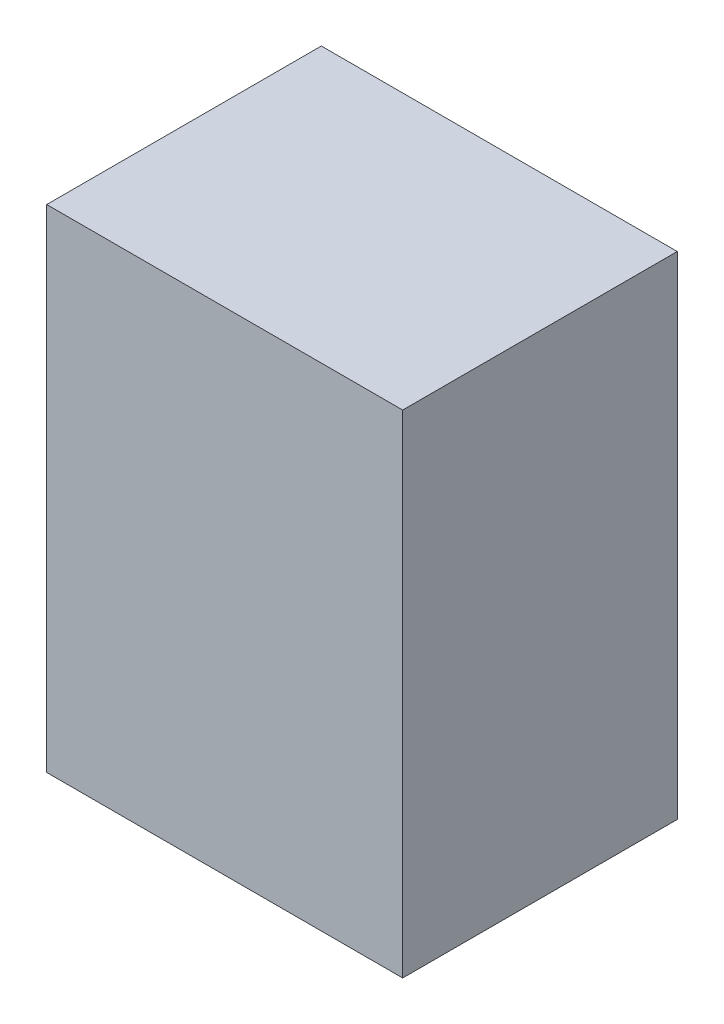
ISO-10303-21;
HEADER;
FILE_DESCRIPTION(('STEP AP214'),'2;1');
FILE_NAME('part.step','',(''),(''),'','','');
FILE_SCHEMA(('AUTOMOTIVE_DESIGN { 1 0 10303 214 1 1 1 1 }'));
ENDSEC;
DATA;
#1=APPLICATION_CONTEXT('core data for automotive mechanical design processes');
#2=APPLICATION_PROTOCOL_DEFINITION('international standard','automotive_design',2000,#1);
#3=PRODUCT_CONTEXT('',#1,'mechanical');
#4=PRODUCT('Part','Part','',(#3));
#5=PRODUCT_RELATED_PRODUCT_CATEGORY('part','',(#4));
#6=PRODUCT_DEFINITION_FORMATION('','',#4);
#7=PRODUCT_DEFINITION_CONTEXT('part definition',#1,'design');
#8=PRODUCT_DEFINITION('design','',#6,#7);
#9=PRODUCT_DEFINITION_SHAPE('','',#8);
#10=(LENGTH_UNIT() NAMED_UNIT(*) SI_UNIT(.MILLI.,.METRE.));
#11=(NAMED_UNIT(*) PLANE_ANGLE_UNIT() SI_UNIT($,.RADIAN.));
#12=(NAMED_UNIT(*) SI_UNIT($,.STERADIAN.) SOLID_ANGLE_UNIT());
#13=UNCERTAINTY_MEASURE_WITH_UNIT(LENGTH_MEASURE(1.E-05),#10,'distance_accuracy_value','');
#14=(GEOMETRIC_REPRESENTATION_CONTEXT(3) GLOBAL_UNCERTAINTY_ASSIGNED_CONTEXT((#13)) GLOBAL_UNIT_ASSIGNED_CONTEXT((#10,
#11,#12)) REPRESENTATION_CONTEXT('',''));
#15=CARTESIAN_POINT('',(0.,0.,0.));
#16=DIRECTION('',(0.,0.,1.));
#17=DIRECTION('',(1.,0.,0.));
#18=AXIS2_PLACEMENT_3D('',#15,#16,#17);
#19=CARTESIAN_POINT('',(58.335,188.09875,-45.));
#20=DIRECTION('',(-1.,0.,0.));
#21=DIRECTION('',(0.,0.,1.));
#22=AXIS2_PLACEMENT_3D('',#19,#20,#21);
#23=PLANE('',#22);
#24=DIRECTION('',(0.,0.,-1.));
#25=VECTOR('',#24,1.);
#26=CARTESIAN_POINT('',(58.335,26.87125,-45.));
#27=LINE('',#26,#25);
#28=CARTESIAN_POINT('',(58.335,26.87125,45.));
#29=VERTEX_POINT('',#28);
#30=CARTESIAN_POINT('',(58.335,26.87125,-45.));
#31=VERTEX_POINT('',#30);
#32=EDGE_CURVE('E108',#29,#31,#27,.T.);
#33=ORIENTED_EDGE('',*,*,#32,.T.);
#34=DIRECTION('',(0.,-1.,0.));
#35=VECTOR('',#34,1.);
#36=CARTESIAN_POINT('',(58.335,188.09875,-45.));
#37=LINE('',#36,#35);
#38=CARTESIAN_POINT('',(58.335,188.09875,-45.));
#39=VERTEX_POINT('',#38);
#40=EDGE_CURVE('E12',#39,#31,#37,.T.);
#41=ORIENTED_EDGE('',*,*,#40,.F.);
#42=DIRECTION('',(0.,0.,-1.));
#43=VECTOR('',#42,1.);
#44=CARTESIAN_POINT('',(58.335,188.09875,-45.));
#45=LINE('',#44,#43);
#46=CARTESIAN_POINT('',(58.335,188.09875,45.));
#47=VERTEX_POINT('',#46);
#48=EDGE_CURVE('E100',#47,#39,#45,.T.);
#49=ORIENTED_EDGE('',*,*,#48,.F.);
#50=DIRECTION('',(0.,-1.,0.));
#51=VECTOR('',#50,1.);
#52=CARTESIAN_POINT('',(58.335,188.09875,45.));
#53=LINE('',#52,#51);
#54=EDGE_CURVE('E104',#47,#29,#53,.T.);
#55=ORIENTED_EDGE('',*,*,#54,.T.);
#56=EDGE_LOOP('',(#33,#41,#49,#55));
#57=FACE_BOUND('',#56,.T.);
#58=ADVANCED_FACE('F46',(#57),#23,.F.);
#59=CARTESIAN_POINT('',(-58.335,188.09875,-45.));
#60=DIRECTION('',(0.,0.,1.));
#61=DIRECTION('',(1.,0.,0.));
#62=AXIS2_PLACEMENT_3D('',#59,#60,#61);
#63=PLANE('',#62);
#64=DIRECTION('',(-1.,0.,0.));
#65=VECTOR('',#64,1.);
#66=CARTESIAN_POINT('',(-58.335,26.87125,-45.));
#67=LINE('',#66,#65);
#68=CARTESIAN_POINT('',(-58.335,26.87125,-45.));
#69=VERTEX_POINT('',#68);
#70=EDGE_CURVE('E101',#31,#69,#67,.T.);
#71=ORIENTED_EDGE('',*,*,#70,.T.);
#72=DIRECTION('',(0.,-1.,0.));
#73=VECTOR('',#72,1.);
#74=CARTESIAN_POINT('',(-58.335,188.09875,-45.));
#75=LINE('',#74,#73);
#76=CARTESIAN_POINT('',(-58.335,188.09875,-45.));
#77=VERTEX_POINT('',#76);
#78=EDGE_CURVE('E53',#77,#69,#75,.T.);
#79=ORIENTED_EDGE('',*,*,#78,.F.);
#80=DIRECTION('',(-1.,0.,0.));
#81=VECTOR('',#80,1.);
#82=CARTESIAN_POINT('',(-58.335,188.09875,-45.));
#83=LINE('',#82,#81);
#84=EDGE_CURVE('E95',#39,#77,#83,.T.);
#85=ORIENTED_EDGE('',*,*,#84,.F.);
#86=ORIENTED_EDGE('',*,*,#40,.T.);
#87=EDGE_LOOP('',(#71,#79,#85,#86));
#88=FACE_BOUND('',#87,.T.);
#89=ADVANCED_FACE('F99',(#88),#63,.F.);
#90=CARTESIAN_POINT('',(-58.335,188.09875,-45.));
#91=DIRECTION('',(1.,0.,0.));
#92=DIRECTION('',(0.,0.,-1.));
#93=AXIS2_PLACEMENT_3D('',#90,#91,#92);
#94=PLANE('',#93);
#95=DIRECTION('',(0.,0.,1.));
#96=VECTOR('',#95,1.);
#97=CARTESIAN_POINT('',(-58.335,26.87125,-45.));
#98=LINE('',#97,#96);
#99=CARTESIAN_POINT('',(-58.335,26.87125,45.));
#100=VERTEX_POINT('',#99);
#101=EDGE_CURVE('E76',#69,#100,#98,.T.);
#102=ORIENTED_EDGE('',*,*,#101,.T.);
#103=DIRECTION('',(0.,-1.,0.));
#104=VECTOR('',#103,1.);
#105=CARTESIAN_POINT('',(-58.335,188.09875,45.));
#106=LINE('',#105,#104);
#107=CARTESIAN_POINT('',(-58.335,188.09875,45.));
#108=VERTEX_POINT('',#107);
#109=EDGE_CURVE('E105',#108,#100,#106,.T.);
#110=ORIENTED_EDGE('',*,*,#109,.F.);
#111=DIRECTION('',(0.,0.,1.));
#112=VECTOR('',#111,1.);
#113=CARTESIAN_POINT('',(-58.335,188.09875,-45.));
#114=LINE('',#113,#112);
#115=EDGE_CURVE('E92',#77,#108,#114,.T.);
#116=ORIENTED_EDGE('',*,*,#115,.F.);
#117=ORIENTED_EDGE('',*,*,#78,.T.);
#118=EDGE_LOOP('',(#102,#110,#116,#117));
#119=FACE_BOUND('',#118,.T.);
#120=ADVANCED_FACE('F103',(#119),#94,.F.);
#121=CARTESIAN_POINT('',(-58.335,188.09875,45.));
#122=DIRECTION('',(0.,0.,-1.));
#123=DIRECTION('',(-1.,0.,0.));
#124=AXIS2_PLACEMENT_3D('',#121,#122,#123);
#125=PLANE('',#124);
#126=DIRECTION('',(1.,0.,0.));
#127=VECTOR('',#126,1.);
#128=CARTESIAN_POINT('',(-58.335,26.87125,45.));
#129=LINE('',#128,#127);
#130=EDGE_CURVE('E82',#100,#29,#129,.T.);
#131=ORIENTED_EDGE('',*,*,#130,.T.);
#132=ORIENTED_EDGE('',*,*,#54,.F.);
#133=DIRECTION('',(1.,0.,0.));
#134=VECTOR('',#133,1.);
#135=CARTESIAN_POINT('',(-58.335,188.09875,45.));
#136=LINE('',#135,#134);
#137=EDGE_CURVE('E65',#108,#47,#136,.T.);
#138=ORIENTED_EDGE('',*,*,#137,.F.);
#139=ORIENTED_EDGE('',*,*,#109,.T.);
#140=EDGE_LOOP('',(#131,#132,#138,#139));
#141=FACE_BOUND('',#140,.T.);
#142=ADVANCED_FACE('F117',(#141),#125,.F.);
#143=CARTESIAN_POINT('',(0.,188.09875,0.));
#144=DIRECTION('',(0.,1.,0.));
#145=DIRECTION('',(0.,0.,1.));
#146=AXIS2_PLACEMENT_3D('',#143,#144,#145);
#147=PLANE('',#146);
#148=ORIENTED_EDGE('',*,*,#48,.T.);
#149=ORIENTED_EDGE('',*,*,#84,.T.);
#150=ORIENTED_EDGE('',*,*,#115,.T.);
#151=ORIENTED_EDGE('',*,*,#137,.T.);
#152=EDGE_LOOP('',(#148,#149,#150,#151));
#153=FACE_BOUND('',#152,.T.);
#154=ADVANCED_FACE('F91',(#153),#147,.T.);
#155=CARTESIAN_POINT('',(0.,26.87125,0.));
#156=DIRECTION('',(0.,1.,0.));
#157=DIRECTION('',(0.,0.,1.));
#158=AXIS2_PLACEMENT_3D('',#155,#156,#157);
#159=PLANE('',#158);
#160=ORIENTED_EDGE('',*,*,#32,.F.);
#161=ORIENTED_EDGE('',*,*,#130,.F.);
#162=ORIENTED_EDGE('',*,*,#101,.F.);
#163=ORIENTED_EDGE('',*,*,#70,.F.);
#164=EDGE_LOOP('',(#160,#161,#162,#163));
#165=FACE_BOUND('',#164,.T.);
#166=ADVANCED_FACE('F116',(#165),#159,.F.);
#167=CLOSED_SHELL('',(#58,#89,#120,#142,#154,#166));
#168=MANIFOLD_SOLID_BREP('B2',#167);
#169=ADVANCED_BREP_SHAPE_REPRESENTATION('',(#18,#168),#14);
#170=SHAPE_DEFINITION_REPRESENTATION(#9,#169);
ENDSEC;
END-ISO-10303-21;
